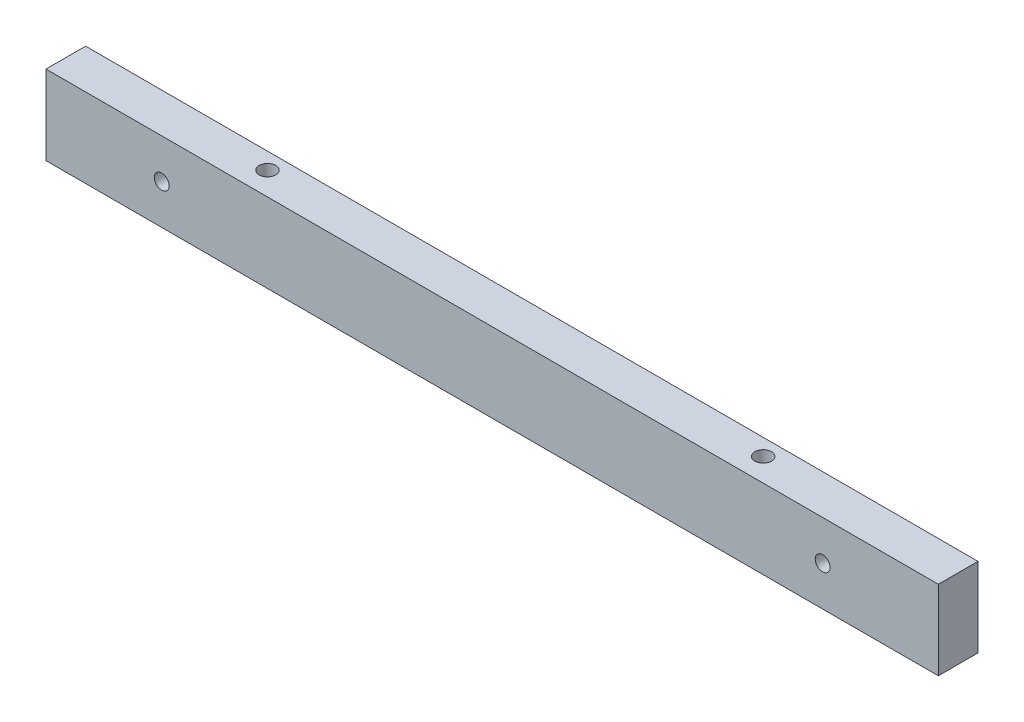
ISO-10303-21;
HEADER;
FILE_DESCRIPTION(('STEP AP214'),'2;1');
FILE_NAME('part.step','',(''),(''),'','','');
FILE_SCHEMA(('AUTOMOTIVE_DESIGN { 1 0 10303 214 1 1 1 1 }'));
ENDSEC;
DATA;
#1=APPLICATION_CONTEXT('core data for automotive mechanical design processes');
#2=APPLICATION_PROTOCOL_DEFINITION('international standard','automotive_design',2000,#1);
#3=PRODUCT_CONTEXT('',#1,'mechanical');
#4=PRODUCT('Part','Part','',(#3));
#5=PRODUCT_RELATED_PRODUCT_CATEGORY('part','',(#4));
#6=PRODUCT_DEFINITION_FORMATION('','',#4);
#7=PRODUCT_DEFINITION_CONTEXT('part definition',#1,'design');
#8=PRODUCT_DEFINITION('design','',#6,#7);
#9=PRODUCT_DEFINITION_SHAPE('','',#8);
#10=(LENGTH_UNIT() NAMED_UNIT(*) SI_UNIT(.MILLI.,.METRE.));
#11=(NAMED_UNIT(*) PLANE_ANGLE_UNIT() SI_UNIT($,.RADIAN.));
#12=(NAMED_UNIT(*) SI_UNIT($,.STERADIAN.) SOLID_ANGLE_UNIT());
#13=UNCERTAINTY_MEASURE_WITH_UNIT(LENGTH_MEASURE(1.E-05),#10,'distance_accuracy_value','');
#14=(GEOMETRIC_REPRESENTATION_CONTEXT(3) GLOBAL_UNCERTAINTY_ASSIGNED_CONTEXT((#13)) GLOBAL_UNIT_ASSIGNED_CONTEXT((#10,
#11,#12)) REPRESENTATION_CONTEXT('',''));
#15=CARTESIAN_POINT('',(0.,0.,0.));
#16=DIRECTION('',(0.,0.,1.));
#17=DIRECTION('',(1.,0.,0.));
#18=AXIS2_PLACEMENT_3D('',#15,#16,#17);
#19=CARTESIAN_POINT('',(-319.5,-24.0000000000015,24.));
#20=DIRECTION('',(0.,0.999999999999999,0.));
#21=DIRECTION('',(-1.,0.,0.));
#22=AXIS2_PLACEMENT_3D('',#19,#20,#21);
#23=PLANE('',#22);
#24=CARTESIAN_POINT('',(-149.999999999999,-24.0000000000007,10.));
#25=DIRECTION('',(0.,0.999999999999999,0.));
#26=DIRECTION('',(-1.,0.,0.));
#27=AXIS2_PLACEMENT_3D('',#24,#25,#26);
#28=CIRCLE('',#27,5.00000000000002);
#29=CARTESIAN_POINT('',(-154.999999999999,-24.0000000000007,10.));
#30=VERTEX_POINT('',#29);
#31=EDGE_CURVE('E129',#30,#30,#28,.T.);
#32=ORIENTED_EDGE('',*,*,#31,.T.);
#33=EDGE_LOOP('',(#32));
#34=FACE_BOUND('',#33,.T.);
#35=CARTESIAN_POINT('',(150.,-23.9999999999999,10.0000000000002));
#36=DIRECTION('',(0.,0.999999999999999,0.));
#37=DIRECTION('',(-1.,0.,0.));
#38=AXIS2_PLACEMENT_3D('',#35,#36,#37);
#39=CIRCLE('',#38,4.99999999999999);
#40=CARTESIAN_POINT('',(145.000000000001,-23.9999999999999,10.0000000000002));
#41=VERTEX_POINT('',#40);
#42=EDGE_CURVE('E128',#41,#41,#39,.T.);
#43=ORIENTED_EDGE('',*,*,#42,.T.);
#44=EDGE_LOOP('',(#43));
#45=FACE_BOUND('',#44,.T.);
#46=DIRECTION('',(1.,0.,0.));
#47=VECTOR('',#46,1.);
#48=CARTESIAN_POINT('',(-319.5,-24.0000000000014,0.));
#49=LINE('',#48,#47);
#50=CARTESIAN_POINT('',(-270.,-24.0000000000013,-6.66133814775094E-13));
#51=VERTEX_POINT('',#50);
#52=CARTESIAN_POINT('',(270.000000000001,-23.9999999999982,-7.7715611723761E-13));
#53=VERTEX_POINT('',#52);
#54=EDGE_CURVE('E148',#51,#53,#49,.T.);
#55=ORIENTED_EDGE('',*,*,#54,.T.);
#56=DIRECTION('',(0.,0.,1.));
#57=VECTOR('',#56,1.);
#58=CARTESIAN_POINT('',(270.,-23.9999999999983,23.9999999999989));
#59=LINE('',#58,#57);
#60=CARTESIAN_POINT('',(270.,-23.9999999999983,23.9999999999989));
#61=VERTEX_POINT('',#60);
#62=EDGE_CURVE('E74',#53,#61,#59,.T.);
#63=ORIENTED_EDGE('',*,*,#62,.T.);
#64=DIRECTION('',(1.,0.,0.));
#65=VECTOR('',#64,1.);
#66=CARTESIAN_POINT('',(-319.5,-24.0000000000015,24.));
#67=LINE('',#66,#65);
#68=CARTESIAN_POINT('',(-269.999999999999,-24.0000000000009,23.9999999999999));
#69=VERTEX_POINT('',#68);
#70=EDGE_CURVE('E58',#69,#61,#67,.T.);
#71=ORIENTED_EDGE('',*,*,#70,.F.);
#72=DIRECTION('',(0.,0.,-1.));
#73=VECTOR('',#72,1.);
#74=CARTESIAN_POINT('',(-269.999999999999,-24.0000000000009,23.9999999999999));
#75=LINE('',#74,#73);
#76=EDGE_CURVE('E100',#69,#51,#75,.T.);
#77=ORIENTED_EDGE('',*,*,#76,.T.);
#78=EDGE_LOOP('',(#55,#63,#71,#77));
#79=FACE_BOUND('',#78,.T.);
#80=ADVANCED_FACE('F49',(#34,#45,#79),#23,.F.);
#81=CARTESIAN_POINT('',(319.5,24.0000000000007,23.9999999999997));
#82=DIRECTION('',(0.,-0.999999999999999,0.));
#83=DIRECTION('',(1.,0.,0.));
#84=AXIS2_PLACEMENT_3D('',#81,#82,#83);
#85=PLANE('',#84);
#86=CARTESIAN_POINT('',(-149.999999999999,23.9999999999984,9.99999999999984));
#87=DIRECTION('',(0.,0.999999999999999,0.));
#88=DIRECTION('',(-1.,0.,0.));
#89=AXIS2_PLACEMENT_3D('',#86,#87,#88);
#90=CIRCLE('',#89,5.00000000000002);
#91=CARTESIAN_POINT('',(-154.999999999999,23.9999999999984,10.));
#92=VERTEX_POINT('',#91);
#93=EDGE_CURVE('E133',#92,#92,#90,.T.);
#94=ORIENTED_EDGE('',*,*,#93,.F.);
#95=EDGE_LOOP('',(#94));
#96=FACE_BOUND('',#95,.T.);
#97=CARTESIAN_POINT('',(150.,24.0000000000006,10.0000000000001));
#98=DIRECTION('',(0.,0.999999999999999,0.));
#99=DIRECTION('',(-1.,0.,0.));
#100=AXIS2_PLACEMENT_3D('',#97,#98,#99);
#101=CIRCLE('',#100,4.99999999999999);
#102=CARTESIAN_POINT('',(145.000000000001,24.0000000000006,10.0000000000002));
#103=VERTEX_POINT('',#102);
#104=EDGE_CURVE('E137',#103,#103,#101,.T.);
#105=ORIENTED_EDGE('',*,*,#104,.F.);
#106=EDGE_LOOP('',(#105));
#107=FACE_BOUND('',#106,.T.);
#108=DIRECTION('',(-1.,0.,0.));
#109=VECTOR('',#108,1.);
#110=CARTESIAN_POINT('',(319.5,24.0000000000007,23.9999999999997));
#111=LINE('',#110,#109);
#112=CARTESIAN_POINT('',(270.,24.0000000000006,23.9999999999997));
#113=VERTEX_POINT('',#112);
#114=CARTESIAN_POINT('',(-269.999999999999,23.9999999999982,24.0000000000001));
#115=VERTEX_POINT('',#114);
#116=EDGE_CURVE('E11',#113,#115,#111,.T.);
#117=ORIENTED_EDGE('',*,*,#116,.F.);
#118=DIRECTION('',(0.,0.,-1.));
#119=VECTOR('',#118,1.);
#120=CARTESIAN_POINT('',(270.,24.0000000000006,23.9999999999997));
#121=LINE('',#120,#119);
#122=CARTESIAN_POINT('',(270.000000000001,24.0000000000008,0.));
#123=VERTEX_POINT('',#122);
#124=EDGE_CURVE('E90',#113,#123,#121,.T.);
#125=ORIENTED_EDGE('',*,*,#124,.T.);
#126=DIRECTION('',(-1.,0.,0.));
#127=VECTOR('',#126,1.);
#128=CARTESIAN_POINT('',(319.5,24.0000000000003,-6.66133814775094E-13));
#129=LINE('',#128,#127);
#130=CARTESIAN_POINT('',(-270.,23.9999999999985,0.));
#131=VERTEX_POINT('',#130);
#132=EDGE_CURVE('E52',#123,#131,#129,.T.);
#133=ORIENTED_EDGE('',*,*,#132,.T.);
#134=DIRECTION('',(0.,0.,-1.));
#135=VECTOR('',#134,1.);
#136=CARTESIAN_POINT('',(-269.999999999999,23.9999999999982,24.0000000000001));
#137=LINE('',#136,#135);
#138=EDGE_CURVE('E66',#115,#131,#137,.T.);
#139=ORIENTED_EDGE('',*,*,#138,.F.);
#140=EDGE_LOOP('',(#117,#125,#133,#139));
#141=FACE_BOUND('',#140,.T.);
#142=ADVANCED_FACE('F110',(#96,#107,#141),#85,.F.);
#143=CARTESIAN_POINT('',(8.32667268468867E-13,-5.82867087928207E-13,23.9999999999997));
#144=DIRECTION('',(0.,0.,1.));
#145=DIRECTION('',(1.,0.,0.));
#146=AXIS2_PLACEMENT_3D('',#143,#144,#145);
#147=PLANE('',#146);
#148=DIRECTION('',(0.,0.999999999999999,0.));
#149=VECTOR('',#148,1.);
#150=CARTESIAN_POINT('',(270.,-25.4999999999988,23.9999999999989));
#151=LINE('',#150,#149);
#152=EDGE_CURVE('E93',#61,#113,#151,.T.);
#153=ORIENTED_EDGE('',*,*,#152,.T.);
#154=ORIENTED_EDGE('',*,*,#116,.T.);
#155=DIRECTION('',(0.,-0.999999999999999,0.));
#156=VECTOR('',#155,1.);
#157=CARTESIAN_POINT('',(-269.999999999999,23.9999999999982,24.0000000000001));
#158=LINE('',#157,#156);
#159=EDGE_CURVE('E112',#115,#69,#158,.T.);
#160=ORIENTED_EDGE('',*,*,#159,.T.);
#161=ORIENTED_EDGE('',*,*,#70,.T.);
#162=EDGE_LOOP('',(#153,#154,#160,#161));
#163=FACE_BOUND('',#162,.T.);
#164=CARTESIAN_POINT('',(-199.999999999999,-1.77635683940025E-12,23.9999999999997));
#165=DIRECTION('',(0.,0.,1.));
#166=DIRECTION('',(1.,0.,0.));
#167=AXIS2_PLACEMENT_3D('',#164,#165,#166);
#168=CIRCLE('',#167,4.49999999999999);
#169=CARTESIAN_POINT('',(-195.499999999999,-1.77485803831701E-12,23.9999999999997));
#170=VERTEX_POINT('',#169);
#171=EDGE_CURVE('E149',#170,#170,#168,.T.);
#172=ORIENTED_EDGE('',*,*,#171,.F.);
#173=EDGE_LOOP('',(#172));
#174=FACE_BOUND('',#173,.T.);
#175=CARTESIAN_POINT('',(200.,0.,23.9999999999997));
#176=DIRECTION('',(0.,0.,1.));
#177=DIRECTION('',(1.,0.,0.));
#178=AXIS2_PLACEMENT_3D('',#175,#176,#177);
#179=CIRCLE('',#178,4.49999999999993);
#180=CARTESIAN_POINT('',(204.5,0.,23.9999999999997));
#181=VERTEX_POINT('',#180);
#182=EDGE_CURVE('E153',#181,#181,#179,.T.);
#183=ORIENTED_EDGE('',*,*,#182,.F.);
#184=EDGE_LOOP('',(#183));
#185=FACE_BOUND('',#184,.T.);
#186=ADVANCED_FACE('F104',(#163,#174,#185),#147,.T.);
#187=CARTESIAN_POINT('',(0.,0.,0.));
#188=DIRECTION('',(0.,0.,1.));
#189=DIRECTION('',(1.,0.,0.));
#190=AXIS2_PLACEMENT_3D('',#187,#188,#189);
#191=PLANE('',#190);
#192=CARTESIAN_POINT('',(-200.,-2.77555756156289E-13,2.22044604925031E-13));
#193=DIRECTION('',(0.,0.,1.));
#194=DIRECTION('',(1.,0.,0.));
#195=AXIS2_PLACEMENT_3D('',#192,#193,#194);
#196=CIRCLE('',#195,4.49999999999999);
#197=CARTESIAN_POINT('',(-195.5,-2.76056955073045E-13,2.22044604925031E-13));
#198=VERTEX_POINT('',#197);
#199=EDGE_CURVE('E144',#198,#198,#196,.T.);
#200=ORIENTED_EDGE('',*,*,#199,.T.);
#201=EDGE_LOOP('',(#200));
#202=FACE_BOUND('',#201,.T.);
#203=CARTESIAN_POINT('',(200.,4.16333634234434E-13,-8.88178419700125E-13));
#204=DIRECTION('',(0.,0.,1.));
#205=DIRECTION('',(1.,0.,0.));
#206=AXIS2_PLACEMENT_3D('',#203,#204,#205);
#207=CIRCLE('',#206,4.49999999999993);
#208=CARTESIAN_POINT('',(204.5,4.17832435317678E-13,-8.88178419700125E-13));
#209=VERTEX_POINT('',#208);
#210=EDGE_CURVE('E132',#209,#209,#207,.T.);
#211=ORIENTED_EDGE('',*,*,#210,.T.);
#212=EDGE_LOOP('',(#211));
#213=FACE_BOUND('',#212,.T.);
#214=ORIENTED_EDGE('',*,*,#132,.F.);
#215=DIRECTION('',(0.,0.999999999999999,0.));
#216=VECTOR('',#215,1.);
#217=CARTESIAN_POINT('',(270.,-25.4999999999996,-6.66133814775094E-13));
#218=LINE('',#217,#216);
#219=EDGE_CURVE('E94',#53,#123,#218,.T.);
#220=ORIENTED_EDGE('',*,*,#219,.F.);
#221=ORIENTED_EDGE('',*,*,#54,.F.);
#222=DIRECTION('',(0.,-0.999999999999999,0.));
#223=VECTOR('',#222,1.);
#224=CARTESIAN_POINT('',(-270.,23.9999999999985,0.));
#225=LINE('',#224,#223);
#226=EDGE_CURVE('E117',#131,#51,#225,.T.);
#227=ORIENTED_EDGE('',*,*,#226,.F.);
#228=EDGE_LOOP('',(#214,#220,#221,#227));
#229=FACE_BOUND('',#228,.T.);
#230=ADVANCED_FACE('F207',(#202,#213,#229),#191,.F.);
#231=CARTESIAN_POINT('',(200.,4.16333634234434E-13,-8.88178419700125E-13));
#232=DIRECTION('',(0.,0.,1.));
#233=DIRECTION('',(1.,0.,0.));
#234=AXIS2_PLACEMENT_3D('',#231,#232,#233);
#235=CYLINDRICAL_SURFACE('',#234,4.49999999999993);
#236=ORIENTED_EDGE('',*,*,#210,.F.);
#237=EDGE_LOOP('',(#236));
#238=FACE_BOUND('',#237,.T.);
#239=ORIENTED_EDGE('',*,*,#182,.T.);
#240=EDGE_LOOP('',(#239));
#241=FACE_BOUND('',#240,.T.);
#242=ADVANCED_FACE('F236',(#238,#241),#235,.F.);
#243=CARTESIAN_POINT('',(-200.,-2.77555756156289E-13,2.22044604925031E-13));
#244=DIRECTION('',(0.,0.,1.));
#245=DIRECTION('',(1.,0.,0.));
#246=AXIS2_PLACEMENT_3D('',#243,#244,#245);
#247=CYLINDRICAL_SURFACE('',#246,4.49999999999999);
#248=ORIENTED_EDGE('',*,*,#199,.F.);
#249=EDGE_LOOP('',(#248));
#250=FACE_BOUND('',#249,.T.);
#251=ORIENTED_EDGE('',*,*,#171,.T.);
#252=EDGE_LOOP('',(#251));
#253=FACE_BOUND('',#252,.T.);
#254=ADVANCED_FACE('F230',(#250,#253),#247,.F.);
#255=CARTESIAN_POINT('',(150.,-23.9999999999999,10.0000000000002));
#256=DIRECTION('',(0.,0.999999999999999,0.));
#257=DIRECTION('',(-1.,0.,0.));
#258=AXIS2_PLACEMENT_3D('',#255,#256,#257);
#259=CYLINDRICAL_SURFACE('',#258,4.99999999999999);
#260=CARTESIAN_POINT('',(145.000000000001,-23.9999999999999,10.0000000000002));
#261=CARTESIAN_POINT('',(145.000000000001,-23.4999999999999,10.0000000000002));
#262=CARTESIAN_POINT('',(145.000000000001,-22.9999999999998,10.0000000000002));
#263=CARTESIAN_POINT('',(145.000000000001,-21.9999999999998,10.0000000000002));
#264=CARTESIAN_POINT('',(145.000000000001,-21.4999999999998,10.0000000000002));
#265=CARTESIAN_POINT('',(145.000000000001,-20.4999999999998,10.0000000000002));
#266=CARTESIAN_POINT('',(145.000000000001,-19.9999999999998,10.0000000000002));
#267=CARTESIAN_POINT('',(145.000000000001,-18.9999999999998,10.0000000000002));
#268=CARTESIAN_POINT('',(145.000000000001,-18.4999999999998,10.0000000000002));
#269=CARTESIAN_POINT('',(145.000000000001,-17.4999999999998,10.0000000000002));
#270=CARTESIAN_POINT('',(145.000000000001,-16.9999999999998,10.0000000000002));
#271=CARTESIAN_POINT('',(145.000000000001,-15.9999999999998,10.0000000000002));
#272=CARTESIAN_POINT('',(145.000000000001,-15.4999999999998,10.0000000000002));
#273=CARTESIAN_POINT('',(145.000000000001,-14.4999999999998,10.0000000000002));
#274=CARTESIAN_POINT('',(145.000000000001,-13.9999999999998,10.0000000000002));
#275=CARTESIAN_POINT('',(145.000000000001,-12.9999999999998,10.0000000000002));
#276=CARTESIAN_POINT('',(145.000000000001,-12.4999999999997,10.0000000000002));
#277=CARTESIAN_POINT('',(145.000000000001,-11.4999999999997,10.0000000000002));
#278=CARTESIAN_POINT('',(145.000000000001,-10.9999999999997,10.0000000000002));
#279=CARTESIAN_POINT('',(145.000000000001,-9.99999999999973,10.0000000000002));
#280=CARTESIAN_POINT('',(145.000000000001,-9.49999999999972,10.0000000000002));
#281=CARTESIAN_POINT('',(145.000000000001,-8.49999999999971,10.0000000000002));
#282=CARTESIAN_POINT('',(145.000000000001,-7.99999999999971,10.0000000000002));
#283=CARTESIAN_POINT('',(145.000000000001,-6.9999999999997,10.0000000000002));
#284=CARTESIAN_POINT('',(145.000000000001,-6.49999999999969,10.0000000000002));
#285=CARTESIAN_POINT('',(145.000000000001,-5.49999999999968,10.0000000000002));
#286=CARTESIAN_POINT('',(145.000000000001,-4.99999999999968,10.0000000000002));
#287=CARTESIAN_POINT('',(145.000000000001,-3.99999999999967,10.0000000000002));
#288=CARTESIAN_POINT('',(145.000000000001,-3.49999999999967,10.0000000000002));
#289=CARTESIAN_POINT('',(145.000000000001,-2.49999999999966,10.0000000000002));
#290=CARTESIAN_POINT('',(145.000000000001,-1.99999999999965,10.0000000000002));
#291=CARTESIAN_POINT('',(145.000000000001,-0.999999999999646,10.0000000000002));
#292=CARTESIAN_POINT('',(145.000000000001,-0.499999999999641,10.0000000000002));
#293=CARTESIAN_POINT('',(145.000000000001,0.500000000000368,10.0000000000002));
#294=CARTESIAN_POINT('',(145.000000000001,1.00000000000037,10.0000000000002));
#295=CARTESIAN_POINT('',(145.000000000001,2.00000000000038,10.0000000000002));
#296=CARTESIAN_POINT('',(145.000000000001,2.50000000000039,10.0000000000002));
#297=CARTESIAN_POINT('',(145.000000000001,3.5000000000004,10.0000000000002));
#298=CARTESIAN_POINT('',(145.000000000001,4.0000000000004,10.0000000000002));
#299=CARTESIAN_POINT('',(145.000000000001,5.00000000000041,10.0000000000002));
#300=CARTESIAN_POINT('',(145.000000000001,5.50000000000041,10.0000000000002));
#301=CARTESIAN_POINT('',(145.000000000001,6.50000000000042,10.0000000000002));
#302=CARTESIAN_POINT('',(145.000000000001,7.00000000000043,10.0000000000002));
#303=CARTESIAN_POINT('',(145.000000000001,8.00000000000044,10.0000000000002));
#304=CARTESIAN_POINT('',(145.000000000001,8.50000000000044,10.0000000000002));
#305=CARTESIAN_POINT('',(145.000000000001,9.50000000000045,10.0000000000002));
#306=CARTESIAN_POINT('',(145.000000000001,10.0000000000005,10.0000000000002));
#307=CARTESIAN_POINT('',(145.000000000001,11.0000000000005,10.0000000000002));
#308=CARTESIAN_POINT('',(145.000000000001,11.5000000000005,10.0000000000002));
#309=CARTESIAN_POINT('',(145.000000000001,12.5000000000005,10.0000000000002));
#310=CARTESIAN_POINT('',(145.000000000001,13.0000000000005,10.0000000000002));
#311=CARTESIAN_POINT('',(145.000000000001,14.0000000000005,10.0000000000002));
#312=CARTESIAN_POINT('',(145.000000000001,14.5000000000005,10.0000000000002));
#313=CARTESIAN_POINT('',(145.000000000001,15.5000000000005,10.0000000000002));
#314=CARTESIAN_POINT('',(145.000000000001,16.0000000000005,10.0000000000002));
#315=CARTESIAN_POINT('',(145.000000000001,17.0000000000005,10.0000000000002));
#316=CARTESIAN_POINT('',(145.000000000001,17.5000000000005,10.0000000000002));
#317=CARTESIAN_POINT('',(145.000000000001,18.5000000000005,10.0000000000002));
#318=CARTESIAN_POINT('',(145.000000000001,19.0000000000005,10.0000000000002));
#319=CARTESIAN_POINT('',(145.000000000001,20.0000000000005,10.0000000000002));
#320=CARTESIAN_POINT('',(145.000000000001,20.5000000000006,10.0000000000002));
#321=CARTESIAN_POINT('',(145.000000000001,21.5000000000006,10.0000000000002));
#322=CARTESIAN_POINT('',(145.000000000001,22.0000000000006,10.0000000000002));
#323=CARTESIAN_POINT('',(145.000000000001,23.0000000000006,10.0000000000002));
#324=CARTESIAN_POINT('',(145.000000000001,23.5000000000006,10.0000000000002));
#325=CARTESIAN_POINT('',(145.000000000001,24.0000000000006,10.0000000000002));
#326=B_SPLINE_CURVE_WITH_KNOTS('',3,(#260,#261,#262,#263,#264,#265,#266,#267,#268,#269,#270,
#271,#272,#273,#274,#275,#276,#277,#278,#279,#280,#281,#282,#283,#284,#285,#286,#287,#288,#289,
#290,#291,#292,#293,#294,#295,#296,#297,#298,#299,#300,#301,#302,#303,#304,#305,#306,#307,#308,
#309,#310,#311,#312,#313,#314,#315,#316,#317,#318,#319,#320,#321,#322,#323,#324,#325),
.UNSPECIFIED.,.F.,.F.,(4,2,2,2,2,2,2,2,2,2,2,2,2,2,2,2,2,2,2,2,2,2,2,2,2,2,2,2,2,2,2,2,4),(0.,
1.50000000000002,3.00000000000003,4.50000000000004,6.00000000000006,7.50000000000007,
9.00000000000008,10.5000000000001,12.0000000000001,13.5000000000001,15.0000000000001,
16.5000000000001,18.0000000000002,19.5000000000002,21.0000000000002,22.5000000000002,
24.0000000000002,25.5000000000002,27.0000000000002,28.5000000000003,30.0000000000003,
31.5000000000003,33.0000000000003,34.5000000000003,36.0000000000003,37.5000000000003,
39.0000000000004,40.5000000000004,42.0000000000004,43.5000000000004,45.0000000000004,
46.5000000000004,48.0000000000004),.UNSPECIFIED.);
#327=EDGE_CURVE('BSEAM216',#41,#103,#326,.T.);
#328=ORIENTED_EDGE('',*,*,#42,.F.);
#329=ORIENTED_EDGE('',*,*,#104,.T.);
#330=ORIENTED_EDGE('',*,*,#327,.T.);
#331=ORIENTED_EDGE('',*,*,#327,.F.);
#332=EDGE_LOOP('',(#328,#330,#329,#331));
#333=FACE_BOUND('',#332,.T.);
#334=ADVANCED_FACE('F216',(#333),#259,.F.);
#335=CARTESIAN_POINT('',(-149.999999999999,-24.0000000000007,10.));
#336=DIRECTION('',(0.,0.999999999999999,0.));
#337=DIRECTION('',(-1.,0.,0.));
#338=AXIS2_PLACEMENT_3D('',#335,#336,#337);
#339=CYLINDRICAL_SURFACE('',#338,5.00000000000002);
#340=CARTESIAN_POINT('',(-154.999999999999,-24.0000000000007,10.));
#341=CARTESIAN_POINT('',(-154.999999999999,-23.5000000000007,10.));
#342=CARTESIAN_POINT('',(-154.999999999999,-23.0000000000008,10.));
#343=CARTESIAN_POINT('',(-154.999999999999,-22.0000000000008,10.));
#344=CARTESIAN_POINT('',(-154.999999999999,-21.5000000000008,10.));
#345=CARTESIAN_POINT('',(-154.999999999999,-20.5000000000008,10.));
#346=CARTESIAN_POINT('',(-154.999999999999,-20.0000000000008,10.));
#347=CARTESIAN_POINT('',(-154.999999999999,-19.0000000000008,10.));
#348=CARTESIAN_POINT('',(-154.999999999999,-18.5000000000008,10.));
#349=CARTESIAN_POINT('',(-154.999999999999,-17.5000000000009,10.));
#350=CARTESIAN_POINT('',(-154.999999999999,-17.0000000000009,10.));
#351=CARTESIAN_POINT('',(-154.999999999999,-16.0000000000009,10.));
#352=CARTESIAN_POINT('',(-154.999999999999,-15.5000000000009,10.));
#353=CARTESIAN_POINT('',(-154.999999999999,-14.5000000000009,10.));
#354=CARTESIAN_POINT('',(-154.999999999999,-14.0000000000009,10.));
#355=CARTESIAN_POINT('',(-154.999999999999,-13.0000000000009,10.));
#356=CARTESIAN_POINT('',(-154.999999999999,-12.5000000000009,10.));
#357=CARTESIAN_POINT('',(-154.999999999999,-11.500000000001,10.));
#358=CARTESIAN_POINT('',(-154.999999999999,-11.000000000001,10.));
#359=CARTESIAN_POINT('',(-154.999999999999,-10.000000000001,10.));
#360=CARTESIAN_POINT('',(-154.999999999999,-9.50000000000099,10.));
#361=CARTESIAN_POINT('',(-154.999999999999,-8.50000000000101,10.));
#362=CARTESIAN_POINT('',(-154.999999999999,-8.00000000000102,10.));
#363=CARTESIAN_POINT('',(-154.999999999999,-7.00000000000104,10.));
#364=CARTESIAN_POINT('',(-154.999999999999,-6.50000000000105,10.));
#365=CARTESIAN_POINT('',(-154.999999999999,-5.50000000000107,10.));
#366=CARTESIAN_POINT('',(-154.999999999999,-5.00000000000107,10.));
#367=CARTESIAN_POINT('',(-154.999999999999,-4.00000000000109,10.));
#368=CARTESIAN_POINT('',(-154.999999999999,-3.5000000000011,10.));
#369=CARTESIAN_POINT('',(-154.999999999999,-2.50000000000112,10.));
#370=CARTESIAN_POINT('',(-154.999999999999,-2.00000000000113,10.));
#371=CARTESIAN_POINT('',(-154.999999999999,-1.00000000000115,10.));
#372=CARTESIAN_POINT('',(-154.999999999999,-0.500000000001155,10.));
#373=CARTESIAN_POINT('',(-154.999999999999,0.499999999998829,10.));
#374=CARTESIAN_POINT('',(-154.999999999999,0.99999999999882,10.));
#375=CARTESIAN_POINT('',(-154.999999999999,1.9999999999988,10.));
#376=CARTESIAN_POINT('',(-154.999999999999,2.49999999999879,10.));
#377=CARTESIAN_POINT('',(-154.999999999999,3.49999999999878,10.));
#378=CARTESIAN_POINT('',(-154.999999999999,3.99999999999877,10.));
#379=CARTESIAN_POINT('',(-154.999999999999,4.99999999999875,10.));
#380=CARTESIAN_POINT('',(-154.999999999999,5.49999999999874,10.));
#381=CARTESIAN_POINT('',(-154.999999999999,6.49999999999872,10.));
#382=CARTESIAN_POINT('',(-154.999999999999,6.99999999999872,10.));
#383=CARTESIAN_POINT('',(-154.999999999999,7.9999999999987,10.));
#384=CARTESIAN_POINT('',(-154.999999999999,8.49999999999869,10.));
#385=CARTESIAN_POINT('',(-154.999999999999,9.49999999999867,10.));
#386=CARTESIAN_POINT('',(-154.999999999999,9.99999999999866,10.));
#387=CARTESIAN_POINT('',(-154.999999999999,10.9999999999986,10.));
#388=CARTESIAN_POINT('',(-154.999999999999,11.4999999999986,10.));
#389=CARTESIAN_POINT('',(-154.999999999999,12.4999999999986,10.));
#390=CARTESIAN_POINT('',(-154.999999999999,12.9999999999986,10.));
#391=CARTESIAN_POINT('',(-154.999999999999,13.9999999999986,10.));
#392=CARTESIAN_POINT('',(-154.999999999999,14.4999999999986,10.));
#393=CARTESIAN_POINT('',(-154.999999999999,15.4999999999986,10.));
#394=CARTESIAN_POINT('',(-154.999999999999,15.9999999999986,10.));
#395=CARTESIAN_POINT('',(-154.999999999999,16.9999999999985,10.));
#396=CARTESIAN_POINT('',(-154.999999999999,17.4999999999985,10.));
#397=CARTESIAN_POINT('',(-154.999999999999,18.4999999999985,10.));
#398=CARTESIAN_POINT('',(-154.999999999999,18.9999999999985,10.));
#399=CARTESIAN_POINT('',(-154.999999999999,19.9999999999985,10.));
#400=CARTESIAN_POINT('',(-154.999999999999,20.4999999999985,10.));
#401=CARTESIAN_POINT('',(-154.999999999999,21.4999999999985,10.));
#402=CARTESIAN_POINT('',(-154.999999999999,21.9999999999985,10.));
#403=CARTESIAN_POINT('',(-154.999999999999,22.9999999999984,10.));
#404=CARTESIAN_POINT('',(-154.999999999999,23.4999999999984,10.));
#405=CARTESIAN_POINT('',(-154.999999999999,23.9999999999984,10.));
#406=B_SPLINE_CURVE_WITH_KNOTS('',3,(#340,#341,#342,#343,#344,#345,#346,#347,#348,#349,#350,
#351,#352,#353,#354,#355,#356,#357,#358,#359,#360,#361,#362,#363,#364,#365,#366,#367,#368,#369,
#370,#371,#372,#373,#374,#375,#376,#377,#378,#379,#380,#381,#382,#383,#384,#385,#386,#387,#388,
#389,#390,#391,#392,#393,#394,#395,#396,#397,#398,#399,#400,#401,#402,#403,#404,#405),
.UNSPECIFIED.,.F.,.F.,(4,2,2,2,2,2,2,2,2,2,2,2,2,2,2,2,2,2,2,2,2,2,2,2,2,2,2,2,2,2,2,2,4),(0.,
1.49999999999998,2.99999999999995,4.49999999999992,5.9999999999999,7.49999999999987,
8.99999999999985,10.4999999999998,11.9999999999998,13.4999999999998,14.9999999999997,
16.4999999999997,17.9999999999997,19.4999999999997,20.9999999999996,22.4999999999996,
23.9999999999996,25.4999999999996,26.9999999999995,28.4999999999995,29.9999999999995,
31.4999999999995,32.9999999999994,34.4999999999994,35.9999999999994,37.4999999999993,
38.9999999999993,40.4999999999993,41.9999999999993,43.4999999999992,44.9999999999992,
46.4999999999992,47.9999999999992),.UNSPECIFIED.);
#407=EDGE_CURVE('BSEAM210',#30,#92,#406,.T.);
#408=ORIENTED_EDGE('',*,*,#31,.F.);
#409=ORIENTED_EDGE('',*,*,#93,.T.);
#410=ORIENTED_EDGE('',*,*,#407,.T.);
#411=ORIENTED_EDGE('',*,*,#407,.F.);
#412=EDGE_LOOP('',(#408,#410,#409,#411));
#413=FACE_BOUND('',#412,.T.);
#414=ADVANCED_FACE('F210',(#413),#339,.F.);
#415=CARTESIAN_POINT('',(-269.999999999999,23.9999999999982,24.0000000000001));
#416=DIRECTION('',(1.,0.,0.));
#417=DIRECTION('',(0.,0.,-1.));
#418=AXIS2_PLACEMENT_3D('',#415,#416,#417);
#419=PLANE('',#418);
#420=ORIENTED_EDGE('',*,*,#159,.F.);
#421=ORIENTED_EDGE('',*,*,#138,.T.);
#422=ORIENTED_EDGE('',*,*,#226,.T.);
#423=ORIENTED_EDGE('',*,*,#76,.F.);
#424=EDGE_LOOP('',(#420,#421,#422,#423));
#425=FACE_BOUND('',#424,.T.);
#426=ADVANCED_FACE('F208',(#425),#419,.F.);
#427=CARTESIAN_POINT('',(270.,-25.4999999999988,23.9999999999989));
#428=DIRECTION('',(-1.,0.,0.));
#429=DIRECTION('',(0.,0.,1.));
#430=AXIS2_PLACEMENT_3D('',#427,#428,#429);
#431=PLANE('',#430);
#432=ORIENTED_EDGE('',*,*,#219,.T.);
#433=ORIENTED_EDGE('',*,*,#124,.F.);
#434=ORIENTED_EDGE('',*,*,#152,.F.);
#435=ORIENTED_EDGE('',*,*,#62,.F.);
#436=EDGE_LOOP('',(#432,#433,#434,#435));
#437=FACE_BOUND('',#436,.T.);
#438=ADVANCED_FACE('F92',(#437),#431,.F.);
#439=CLOSED_SHELL('',(#80,#142,#186,#230,#242,#254,#334,#414,#426,#438));
#440=MANIFOLD_SOLID_BREP('B2',#439);
#441=ADVANCED_BREP_SHAPE_REPRESENTATION('',(#18,#440),#14);
#442=SHAPE_DEFINITION_REPRESENTATION(#9,#441);
ENDSEC;
END-ISO-10303-21;
